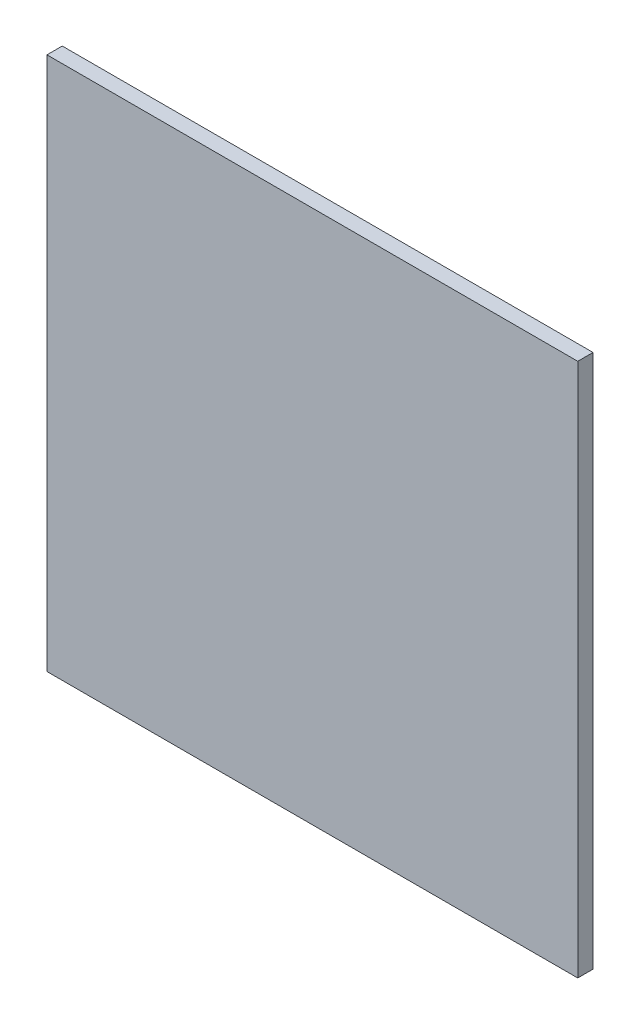
ISO-10303-21;
HEADER;
FILE_DESCRIPTION(('STEP AP214'),'2;1');
FILE_NAME('part.step','',(''),(''),'','','');
FILE_SCHEMA(('AUTOMOTIVE_DESIGN { 1 0 10303 214 1 1 1 1 }'));
ENDSEC;
DATA;
#1=APPLICATION_CONTEXT('core data for automotive mechanical design processes');
#2=APPLICATION_PROTOCOL_DEFINITION('international standard','automotive_design',2000,#1);
#3=PRODUCT_CONTEXT('',#1,'mechanical');
#4=PRODUCT('Part','Part','',(#3));
#5=PRODUCT_RELATED_PRODUCT_CATEGORY('part','',(#4));
#6=PRODUCT_DEFINITION_FORMATION('','',#4);
#7=PRODUCT_DEFINITION_CONTEXT('part definition',#1,'design');
#8=PRODUCT_DEFINITION('design','',#6,#7);
#9=PRODUCT_DEFINITION_SHAPE('','',#8);
#10=(LENGTH_UNIT() NAMED_UNIT(*) SI_UNIT(.MILLI.,.METRE.));
#11=(NAMED_UNIT(*) PLANE_ANGLE_UNIT() SI_UNIT($,.RADIAN.));
#12=(NAMED_UNIT(*) SI_UNIT($,.STERADIAN.) SOLID_ANGLE_UNIT());
#13=UNCERTAINTY_MEASURE_WITH_UNIT(LENGTH_MEASURE(1.E-05),#10,'distance_accuracy_value','');
#14=(GEOMETRIC_REPRESENTATION_CONTEXT(3) GLOBAL_UNCERTAINTY_ASSIGNED_CONTEXT((#13)) GLOBAL_UNIT_ASSIGNED_CONTEXT((#10,
#11,#12)) REPRESENTATION_CONTEXT('',''));
#15=CARTESIAN_POINT('',(0.,0.,0.));
#16=DIRECTION('',(0.,0.,1.));
#17=DIRECTION('',(1.,0.,0.));
#18=AXIS2_PLACEMENT_3D('',#15,#16,#17);
#19=CARTESIAN_POINT('',(4.00969354361939,88.7638581771595,2.54));
#20=DIRECTION('',(0.,0.,1.));
#21=DIRECTION('',(-0.670378619121368,0.74201920933688,0.));
#22=AXIS2_PLACEMENT_3D('',#19,#20,#21);
#23=PLANE('',#22);
#24=CARTESIAN_POINT('',(88.2132574754223,88.7638581792431,2.54));
#25=DIRECTION('',(-1.,-2.333713752442E-11,0.));
#26=VECTOR('',#25,1.);
#27=LINE('',#24,#26);
#28=CARTESIAN_POINT('',(-7.71320507464424E-10,88.7638581771845,2.54));
#29=VERTEX_POINT('',#28);
#30=CARTESIAN_POINT('',(88.2132579754223,88.7638581792431,2.54));
#31=VERTEX_POINT('',#30);
#32=EDGE_CURVE('E15',#29,#31,#27,.F.);
#33=ORIENTED_EDGE('',*,*,#32,.F.);
#34=CARTESIAN_POINT('',(-7.71320507464424E-10,88.7638581771845,2.54));
#35=DIRECTION('',(8.68957843095063E-12,-1.,0.));
#36=VECTOR('',#35,1.);
#37=LINE('',#34,#36);
#38=CARTESIAN_POINT('',(0.,0.,2.54));
#39=VERTEX_POINT('',#38);
#40=EDGE_CURVE('E123',#39,#29,#37,.F.);
#41=ORIENTED_EDGE('',*,*,#40,.F.);
#42=CARTESIAN_POINT('',(4.99999999736822E-07,0.,2.54));
#43=DIRECTION('',(1.,1.93193194208522E-11,0.));
#44=VECTOR('',#43,1.);
#45=LINE('',#42,#44);
#46=CARTESIAN_POINT('',(88.2132579782003,1.70422009837523E-09,2.54));
#47=VERTEX_POINT('',#46);
#48=EDGE_CURVE('E117',#47,#39,#45,.F.);
#49=ORIENTED_EDGE('',*,*,#48,.F.);
#50=CARTESIAN_POINT('',(88.2132579782003,5.01704219835197E-07,2.54));
#51=DIRECTION('',(-3.12965223110174E-11,1.,0.));
#52=VECTOR('',#51,1.);
#53=LINE('',#50,#52);
#54=EDGE_CURVE('E106',#31,#47,#53,.F.);
#55=ORIENTED_EDGE('',*,*,#54,.F.);
#56=EDGE_LOOP('',(#33,#41,#49,#55));
#57=FACE_BOUND('',#56,.T.);
#58=ADVANCED_FACE('F98',(#57),#23,.T.);
#59=OPEN_SHELL('',(#58));
#60=SHELL_BASED_SURFACE_MODEL('B2',(#59));
#61=CARTESIAN_POINT('',(0.,0.,2.54));
#62=DIRECTION('',(1.,0.,0.));
#63=DIRECTION('',(0.,0.,-1.));
#64=AXIS2_PLACEMENT_3D('',#61,#62,#63);
#65=PLANE('',#64);
#66=DIRECTION('',(0.,-1.,0.));
#67=VECTOR('',#66,1.);
#68=CARTESIAN_POINT('',(0.,0.,0.));
#69=LINE('',#68,#67);
#70=CARTESIAN_POINT('',(0.,88.7638581774419,0.));
#71=VERTEX_POINT('',#70);
#72=CARTESIAN_POINT('',(0.,0.,0.));
#73=VERTEX_POINT('',#72);
#74=EDGE_CURVE('E241',#71,#73,#69,.T.);
#75=ORIENTED_EDGE('',*,*,#74,.T.);
#76=DIRECTION('',(0.,0.,-1.));
#77=VECTOR('',#76,1.);
#78=CARTESIAN_POINT('',(0.,0.,2.54));
#79=LINE('',#78,#77);
#80=CARTESIAN_POINT('',(0.,0.,2.54));
#81=VERTEX_POINT('',#80);
#82=EDGE_CURVE('E96',#81,#73,#79,.T.);
#83=ORIENTED_EDGE('',*,*,#82,.F.);
#84=DIRECTION('',(0.,-1.,0.));
#85=VECTOR('',#84,1.);
#86=CARTESIAN_POINT('',(0.,0.,2.54));
#87=LINE('',#86,#85);
#88=CARTESIAN_POINT('',(0.,88.7638581774419,2.54));
#89=VERTEX_POINT('',#88);
#90=EDGE_CURVE('E229',#89,#81,#87,.T.);
#91=ORIENTED_EDGE('',*,*,#90,.F.);
#92=DIRECTION('',(0.,0.,-1.));
#93=VECTOR('',#92,1.);
#94=CARTESIAN_POINT('',(0.,88.7638581774419,2.54));
#95=LINE('',#94,#93);
#96=EDGE_CURVE('E237',#89,#71,#95,.T.);
#97=ORIENTED_EDGE('',*,*,#96,.T.);
#98=EDGE_LOOP('',(#75,#83,#91,#97));
#99=FACE_BOUND('',#98,.T.);
#100=ADVANCED_FACE('F178',(#99),#65,.F.);
#101=CARTESIAN_POINT('',(0.,0.,2.54));
#102=DIRECTION('',(0.,1.,0.));
#103=DIRECTION('',(0.,0.,1.));
#104=AXIS2_PLACEMENT_3D('',#101,#102,#103);
#105=PLANE('',#104);
#106=DIRECTION('',(1.,0.,0.));
#107=VECTOR('',#106,1.);
#108=CARTESIAN_POINT('',(0.,0.,0.));
#109=LINE('',#108,#107);
#110=CARTESIAN_POINT('',(88.2132579771556,0.,0.));
#111=VERTEX_POINT('',#110);
#112=EDGE_CURVE('E233',#73,#111,#109,.T.);
#113=ORIENTED_EDGE('',*,*,#112,.T.);
#114=DIRECTION('',(0.,0.,-1.));
#115=VECTOR('',#114,1.);
#116=CARTESIAN_POINT('',(88.2132579771556,0.,2.54));
#117=LINE('',#116,#115);
#118=CARTESIAN_POINT('',(88.2132579771556,0.,2.54));
#119=VERTEX_POINT('',#118);
#120=EDGE_CURVE('E186',#119,#111,#117,.T.);
#121=ORIENTED_EDGE('',*,*,#120,.F.);
#122=DIRECTION('',(1.,0.,0.));
#123=VECTOR('',#122,1.);
#124=CARTESIAN_POINT('',(0.,0.,2.54));
#125=LINE('',#124,#123);
#126=EDGE_CURVE('E224',#81,#119,#125,.T.);
#127=ORIENTED_EDGE('',*,*,#126,.F.);
#128=ORIENTED_EDGE('',*,*,#82,.T.);
#129=EDGE_LOOP('',(#113,#121,#127,#128));
#130=FACE_BOUND('',#129,.T.);
#131=ADVANCED_FACE('F232',(#130),#105,.F.);
#132=CARTESIAN_POINT('',(88.2132579771556,0.,2.54));
#133=DIRECTION('',(-1.,0.,0.));
#134=DIRECTION('',(0.,0.,1.));
#135=AXIS2_PLACEMENT_3D('',#132,#133,#134);
#136=PLANE('',#135);
#137=DIRECTION('',(0.,1.,0.));
#138=VECTOR('',#137,1.);
#139=CARTESIAN_POINT('',(88.2132579771556,0.,0.));
#140=LINE('',#139,#138);
#141=CARTESIAN_POINT('',(88.2132579771556,88.7638581774419,0.));
#142=VERTEX_POINT('',#141);
#143=EDGE_CURVE('E211',#111,#142,#140,.T.);
#144=ORIENTED_EDGE('',*,*,#143,.T.);
#145=DIRECTION('',(0.,0.,-1.));
#146=VECTOR('',#145,1.);
#147=CARTESIAN_POINT('',(88.2132579771556,88.7638581774419,2.54));
#148=LINE('',#147,#146);
#149=CARTESIAN_POINT('',(88.2132579771556,88.7638581774419,2.54));
#150=VERTEX_POINT('',#149);
#151=EDGE_CURVE('E234',#150,#142,#148,.T.);
#152=ORIENTED_EDGE('',*,*,#151,.F.);
#153=DIRECTION('',(0.,1.,0.));
#154=VECTOR('',#153,1.);
#155=CARTESIAN_POINT('',(88.2132579771556,0.,2.54));
#156=LINE('',#155,#154);
#157=EDGE_CURVE('E227',#119,#150,#156,.T.);
#158=ORIENTED_EDGE('',*,*,#157,.F.);
#159=ORIENTED_EDGE('',*,*,#120,.T.);
#160=EDGE_LOOP('',(#144,#152,#158,#159));
#161=FACE_BOUND('',#160,.T.);
#162=ADVANCED_FACE('F235',(#161),#136,.F.);
#163=CARTESIAN_POINT('',(0.,88.7638581774419,2.54));
#164=DIRECTION('',(0.,-1.,0.));
#165=DIRECTION('',(0.,0.,-1.));
#166=AXIS2_PLACEMENT_3D('',#163,#164,#165);
#167=PLANE('',#166);
#168=DIRECTION('',(-1.,0.,0.));
#169=VECTOR('',#168,1.);
#170=CARTESIAN_POINT('',(0.,88.7638581774419,0.));
#171=LINE('',#170,#169);
#172=EDGE_CURVE('E217',#142,#71,#171,.T.);
#173=ORIENTED_EDGE('',*,*,#172,.T.);
#174=ORIENTED_EDGE('',*,*,#96,.F.);
#175=DIRECTION('',(-1.,0.,0.));
#176=VECTOR('',#175,1.);
#177=CARTESIAN_POINT('',(0.,88.7638581774419,2.54));
#178=LINE('',#177,#176);
#179=EDGE_CURVE('E194',#150,#89,#178,.T.);
#180=ORIENTED_EDGE('',*,*,#179,.F.);
#181=ORIENTED_EDGE('',*,*,#151,.T.);
#182=EDGE_LOOP('',(#173,#174,#180,#181));
#183=FACE_BOUND('',#182,.T.);
#184=ADVANCED_FACE('F248',(#183),#167,.F.);
#185=CARTESIAN_POINT('',(0.,0.,2.54));
#186=DIRECTION('',(0.,0.,-1.));
#187=DIRECTION('',(-1.,0.,0.));
#188=AXIS2_PLACEMENT_3D('',#185,#186,#187);
#189=PLANE('',#188);
#190=ORIENTED_EDGE('',*,*,#90,.T.);
#191=ORIENTED_EDGE('',*,*,#126,.T.);
#192=ORIENTED_EDGE('',*,*,#157,.T.);
#193=ORIENTED_EDGE('',*,*,#179,.T.);
#194=EDGE_LOOP('',(#190,#191,#192,#193));
#195=FACE_BOUND('',#194,.T.);
#196=ADVANCED_FACE('F225',(#195),#189,.F.);
#197=CARTESIAN_POINT('',(0.,0.,0.));
#198=DIRECTION('',(0.,0.,-1.));
#199=DIRECTION('',(-1.,0.,0.));
#200=AXIS2_PLACEMENT_3D('',#197,#198,#199);
#201=PLANE('',#200);
#202=ORIENTED_EDGE('',*,*,#74,.F.);
#203=ORIENTED_EDGE('',*,*,#172,.F.);
#204=ORIENTED_EDGE('',*,*,#143,.F.);
#205=ORIENTED_EDGE('',*,*,#112,.F.);
#206=EDGE_LOOP('',(#202,#203,#204,#205));
#207=FACE_BOUND('',#206,.T.);
#208=ADVANCED_FACE('F251',(#207),#201,.T.);
#209=CLOSED_SHELL('',(#100,#131,#162,#184,#196,#208));
#210=MANIFOLD_SOLID_BREP('B9',#209);
#211=ADVANCED_BREP_SHAPE_REPRESENTATION('',(#18,#210),#14);
#212=MANIFOLD_SURFACE_SHAPE_REPRESENTATION('',(#18,#60),#14);
#213=SHAPE_REPRESENTATION('',(#18),#14);
#214=SHAPE_DEFINITION_REPRESENTATION(#9,#213);
#215=SHAPE_REPRESENTATION_RELATIONSHIP('','',#213,#211);
#216=SHAPE_REPRESENTATION_RELATIONSHIP('','',#213,#212);
ENDSEC;
END-ISO-10303-21;
